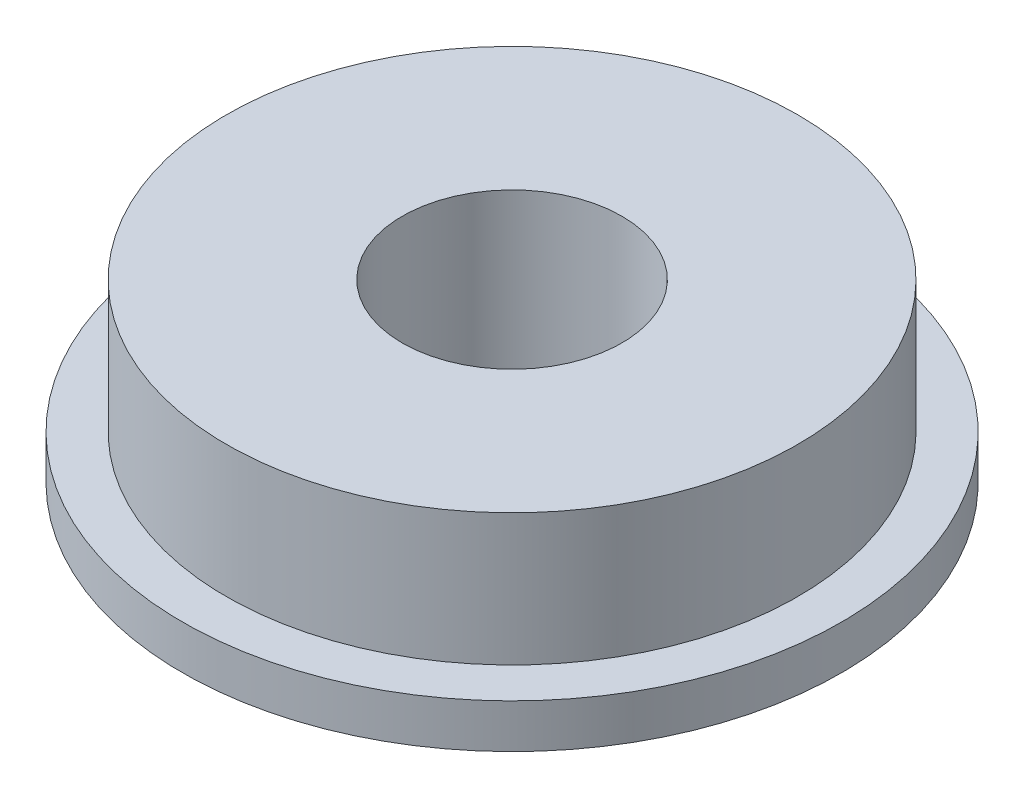
ISO-10303-21;
HEADER;
FILE_DESCRIPTION(('STEP AP214'),'2;1');
FILE_NAME('part.step','',(''),(''),'','','');
FILE_SCHEMA(('AUTOMOTIVE_DESIGN { 1 0 10303 214 1 1 1 1 }'));
ENDSEC;
DATA;
#1=APPLICATION_CONTEXT('core data for automotive mechanical design processes');
#2=APPLICATION_PROTOCOL_DEFINITION('international standard','automotive_design',2000,#1);
#3=PRODUCT_CONTEXT('',#1,'mechanical');
#4=PRODUCT('Part','Part','',(#3));
#5=PRODUCT_RELATED_PRODUCT_CATEGORY('part','',(#4));
#6=PRODUCT_DEFINITION_FORMATION('','',#4);
#7=PRODUCT_DEFINITION_CONTEXT('part definition',#1,'design');
#8=PRODUCT_DEFINITION('design','',#6,#7);
#9=PRODUCT_DEFINITION_SHAPE('','',#8);
#10=(LENGTH_UNIT() NAMED_UNIT(*) SI_UNIT(.MILLI.,.METRE.));
#11=(NAMED_UNIT(*) PLANE_ANGLE_UNIT() SI_UNIT($,.RADIAN.));
#12=(NAMED_UNIT(*) SI_UNIT($,.STERADIAN.) SOLID_ANGLE_UNIT());
#13=UNCERTAINTY_MEASURE_WITH_UNIT(LENGTH_MEASURE(1.E-05),#10,'distance_accuracy_value','');
#14=(GEOMETRIC_REPRESENTATION_CONTEXT(3) GLOBAL_UNCERTAINTY_ASSIGNED_CONTEXT((#13)) GLOBAL_UNIT_ASSIGNED_CONTEXT((#10,
#11,#12)) REPRESENTATION_CONTEXT('',''));
#15=CARTESIAN_POINT('',(0.,0.,0.));
#16=DIRECTION('',(0.,0.,1.));
#17=DIRECTION('',(1.,0.,0.));
#18=AXIS2_PLACEMENT_3D('',#15,#16,#17);
#19=CARTESIAN_POINT('',(7.5,0.,0.));
#20=DIRECTION('',(0.,-1.,0.));
#21=DIRECTION('',(0.,0.,-1.));
#22=AXIS2_PLACEMENT_3D('',#19,#20,#21);
#23=PLANE('',#22);
#24=CARTESIAN_POINT('',(0.,0.,0.));
#25=DIRECTION('',(0.,-1.,0.));
#26=DIRECTION('',(0.,0.,-1.));
#27=AXIS2_PLACEMENT_3D('',#24,#25,#26);
#28=CIRCLE('',#27,7.5);
#29=CARTESIAN_POINT('',(0.,0.,-7.5));
#30=VERTEX_POINT('',#29);
#31=EDGE_CURVE('E55',#30,#30,#28,.T.);
#32=ORIENTED_EDGE('',*,*,#31,.T.);
#33=EDGE_LOOP('',(#32));
#34=FACE_BOUND('',#33,.T.);
#35=CARTESIAN_POINT('',(0.,0.,0.));
#36=DIRECTION('',(0.,-1.,0.));
#37=DIRECTION('',(0.,0.,-1.));
#38=AXIS2_PLACEMENT_3D('',#35,#36,#37);
#39=CIRCLE('',#38,2.5);
#40=CARTESIAN_POINT('',(0.,0.,-2.5));
#41=VERTEX_POINT('',#40);
#42=EDGE_CURVE('E10',#41,#41,#39,.T.);
#43=ORIENTED_EDGE('',*,*,#42,.F.);
#44=EDGE_LOOP('',(#43));
#45=FACE_BOUND('',#44,.T.);
#46=ADVANCED_FACE('F33',(#34,#45),#23,.T.);
#47=CARTESIAN_POINT('',(0.,0.,0.));
#48=DIRECTION('',(0.,-1.,0.));
#49=DIRECTION('',(0.,0.,-1.));
#50=AXIS2_PLACEMENT_3D('',#47,#48,#49);
#51=CYLINDRICAL_SURFACE('',#50,2.5);
#52=ORIENTED_EDGE('',*,*,#42,.T.);
#53=EDGE_LOOP('',(#52));
#54=FACE_BOUND('',#53,.T.);
#55=CARTESIAN_POINT('',(0.,4.,0.));
#56=DIRECTION('',(0.,-1.,0.));
#57=DIRECTION('',(0.,0.,-1.));
#58=AXIS2_PLACEMENT_3D('',#55,#56,#57);
#59=CIRCLE('',#58,2.5);
#60=CARTESIAN_POINT('',(0.,4.,-2.5));
#61=VERTEX_POINT('',#60);
#62=EDGE_CURVE('E39',#61,#61,#59,.T.);
#63=ORIENTED_EDGE('',*,*,#62,.F.);
#64=EDGE_LOOP('',(#63));
#65=FACE_BOUND('',#64,.T.);
#66=ADVANCED_FACE('F73',(#54,#65),#51,.F.);
#67=CARTESIAN_POINT('',(2.5,4.,0.));
#68=DIRECTION('',(0.,1.,0.));
#69=DIRECTION('',(0.,0.,1.));
#70=AXIS2_PLACEMENT_3D('',#67,#68,#69);
#71=PLANE('',#70);
#72=ORIENTED_EDGE('',*,*,#62,.T.);
#73=EDGE_LOOP('',(#72));
#74=FACE_BOUND('',#73,.T.);
#75=CARTESIAN_POINT('',(0.,4.,0.));
#76=DIRECTION('',(0.,-1.,0.));
#77=DIRECTION('',(0.,0.,-1.));
#78=AXIS2_PLACEMENT_3D('',#75,#76,#77);
#79=CIRCLE('',#78,6.5);
#80=CARTESIAN_POINT('',(0.,4.,-6.5));
#81=VERTEX_POINT('',#80);
#82=EDGE_CURVE('E43',#81,#81,#79,.T.);
#83=ORIENTED_EDGE('',*,*,#82,.F.);
#84=EDGE_LOOP('',(#83));
#85=FACE_BOUND('',#84,.T.);
#86=ADVANCED_FACE('F77',(#74,#85),#71,.T.);
#87=CARTESIAN_POINT('',(0.,0.,0.));
#88=DIRECTION('',(0.,-1.,0.));
#89=DIRECTION('',(0.,0.,-1.));
#90=AXIS2_PLACEMENT_3D('',#87,#88,#89);
#91=CYLINDRICAL_SURFACE('',#90,6.5);
#92=ORIENTED_EDGE('',*,*,#82,.T.);
#93=EDGE_LOOP('',(#92));
#94=FACE_BOUND('',#93,.T.);
#95=CARTESIAN_POINT('',(0.,1.,0.));
#96=DIRECTION('',(0.,-1.,0.));
#97=DIRECTION('',(0.,0.,-1.));
#98=AXIS2_PLACEMENT_3D('',#95,#96,#97);
#99=CIRCLE('',#98,6.5);
#100=CARTESIAN_POINT('',(0.,1.,-6.5));
#101=VERTEX_POINT('',#100);
#102=EDGE_CURVE('E47',#101,#101,#99,.T.);
#103=ORIENTED_EDGE('',*,*,#102,.F.);
#104=EDGE_LOOP('',(#103));
#105=FACE_BOUND('',#104,.T.);
#106=ADVANCED_FACE('F69',(#94,#105),#91,.T.);
#107=CARTESIAN_POINT('',(6.5,1.,0.));
#108=DIRECTION('',(0.,1.,0.));
#109=DIRECTION('',(0.,0.,1.));
#110=AXIS2_PLACEMENT_3D('',#107,#108,#109);
#111=PLANE('',#110);
#112=ORIENTED_EDGE('',*,*,#102,.T.);
#113=EDGE_LOOP('',(#112));
#114=FACE_BOUND('',#113,.T.);
#115=CARTESIAN_POINT('',(0.,1.,0.));
#116=DIRECTION('',(0.,-1.,0.));
#117=DIRECTION('',(0.,0.,-1.));
#118=AXIS2_PLACEMENT_3D('',#115,#116,#117);
#119=CIRCLE('',#118,7.5);
#120=CARTESIAN_POINT('',(0.,1.,-7.5));
#121=VERTEX_POINT('',#120);
#122=EDGE_CURVE('E52',#121,#121,#119,.T.);
#123=ORIENTED_EDGE('',*,*,#122,.F.);
#124=EDGE_LOOP('',(#123));
#125=FACE_BOUND('',#124,.T.);
#126=ADVANCED_FACE('F63',(#114,#125),#111,.T.);
#127=CARTESIAN_POINT('',(0.,0.,0.));
#128=DIRECTION('',(0.,-1.,0.));
#129=DIRECTION('',(0.,0.,-1.));
#130=AXIS2_PLACEMENT_3D('',#127,#128,#129);
#131=CYLINDRICAL_SURFACE('',#130,7.5);
#132=ORIENTED_EDGE('',*,*,#122,.T.);
#133=EDGE_LOOP('',(#132));
#134=FACE_BOUND('',#133,.T.);
#135=ORIENTED_EDGE('',*,*,#31,.F.);
#136=EDGE_LOOP('',(#135));
#137=FACE_BOUND('',#136,.T.);
#138=ADVANCED_FACE('F61',(#134,#137),#131,.T.);
#139=CLOSED_SHELL('',(#46,#66,#86,#106,#126,#138));
#140=MANIFOLD_SOLID_BREP('B2',#139);
#141=ADVANCED_BREP_SHAPE_REPRESENTATION('',(#18,#140),#14);
#142=SHAPE_DEFINITION_REPRESENTATION(#9,#141);
ENDSEC;
END-ISO-10303-21;
